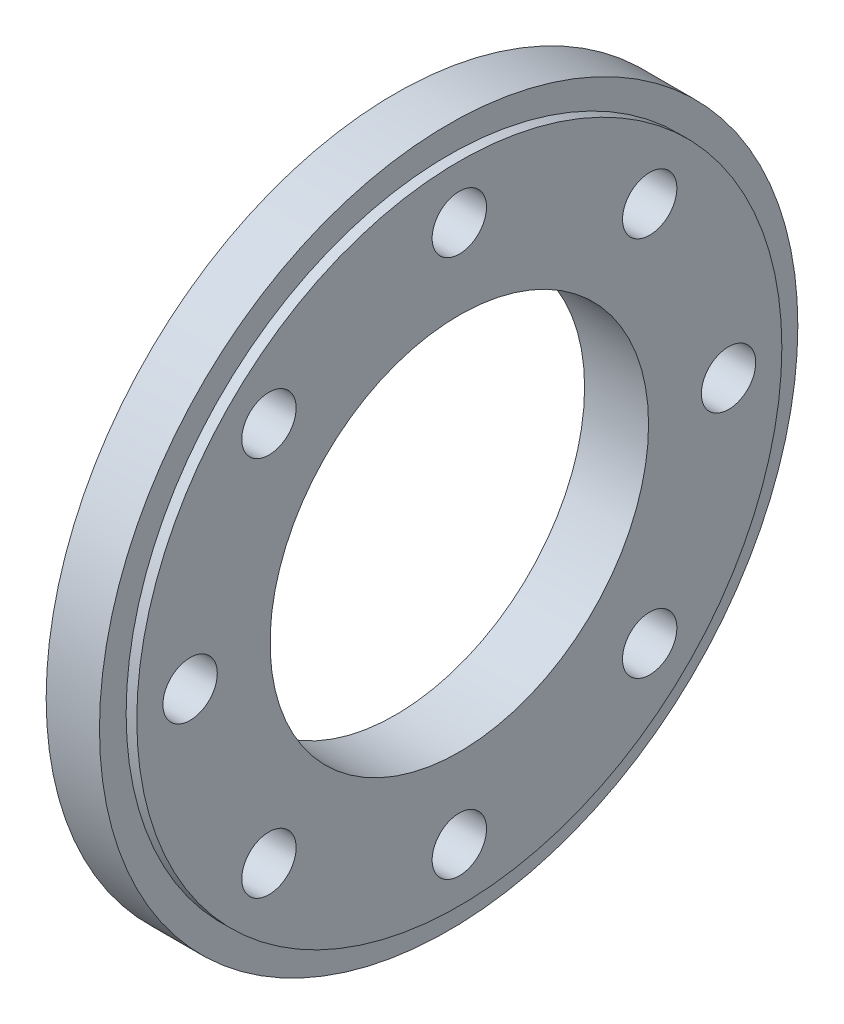
ISO-10303-21;
HEADER;
FILE_DESCRIPTION(('STEP AP214'),'2;1');
FILE_NAME('part.step','',(''),(''),'','','');
FILE_SCHEMA(('AUTOMOTIVE_DESIGN { 1 0 10303 214 1 1 1 1 }'));
ENDSEC;
DATA;
#1=APPLICATION_CONTEXT('core data for automotive mechanical design processes');
#2=APPLICATION_PROTOCOL_DEFINITION('international standard','automotive_design',2000,#1);
#3=PRODUCT_CONTEXT('',#1,'mechanical');
#4=PRODUCT('Part','Part','',(#3));
#5=PRODUCT_RELATED_PRODUCT_CATEGORY('part','',(#4));
#6=PRODUCT_DEFINITION_FORMATION('','',#4);
#7=PRODUCT_DEFINITION_CONTEXT('part definition',#1,'design');
#8=PRODUCT_DEFINITION('design','',#6,#7);
#9=PRODUCT_DEFINITION_SHAPE('','',#8);
#10=(LENGTH_UNIT() NAMED_UNIT(*) SI_UNIT(.MILLI.,.METRE.));
#11=(NAMED_UNIT(*) PLANE_ANGLE_UNIT() SI_UNIT($,.RADIAN.));
#12=(NAMED_UNIT(*) SI_UNIT($,.STERADIAN.) SOLID_ANGLE_UNIT());
#13=UNCERTAINTY_MEASURE_WITH_UNIT(LENGTH_MEASURE(1.E-05),#10,'distance_accuracy_value','');
#14=(GEOMETRIC_REPRESENTATION_CONTEXT(3) GLOBAL_UNCERTAINTY_ASSIGNED_CONTEXT((#13)) GLOBAL_UNIT_ASSIGNED_CONTEXT((#10,
#11,#12)) REPRESENTATION_CONTEXT('',''));
#15=CARTESIAN_POINT('',(0.,0.,0.));
#16=DIRECTION('',(0.,0.,1.));
#17=DIRECTION('',(1.,0.,0.));
#18=AXIS2_PLACEMENT_3D('',#15,#16,#17);
#19=CARTESIAN_POINT('',(6.,0.,0.));
#20=DIRECTION('',(1.,0.,0.));
#21=DIRECTION('',(0.,0.,-1.));
#22=AXIS2_PLACEMENT_3D('',#19,#20,#21);
#23=PLANE('',#22);
#24=CARTESIAN_POINT('',(6.,35.7088924499206,35.7088924499206));
#25=DIRECTION('',(1.,0.,0.));
#26=DIRECTION('',(0.,0.,-1.));
#27=AXIS2_PLACEMENT_3D('',#24,#25,#26);
#28=CIRCLE('',#27,5.1);
#29=CARTESIAN_POINT('',(6.,35.7088924499206,30.6088924499206));
#30=VERTEX_POINT('',#29);
#31=EDGE_CURVE('E114',#30,#30,#28,.T.);
#32=ORIENTED_EDGE('',*,*,#31,.F.);
#33=EDGE_LOOP('',(#32));
#34=FACE_BOUND('',#33,.T.);
#35=CARTESIAN_POINT('',(6.,-35.7088924499206,35.7088924499206));
#36=DIRECTION('',(1.,0.,0.));
#37=DIRECTION('',(0.,0.,-1.));
#38=AXIS2_PLACEMENT_3D('',#35,#36,#37);
#39=CIRCLE('',#38,5.1);
#40=CARTESIAN_POINT('',(6.,-35.7088924499206,30.6088924499206));
#41=VERTEX_POINT('',#40);
#42=EDGE_CURVE('E98',#41,#41,#39,.T.);
#43=ORIENTED_EDGE('',*,*,#42,.F.);
#44=EDGE_LOOP('',(#43));
#45=FACE_BOUND('',#44,.T.);
#46=CARTESIAN_POINT('',(6.,-35.7088924499206,-35.7088924499206));
#47=DIRECTION('',(1.,0.,0.));
#48=DIRECTION('',(0.,0.,-1.));
#49=AXIS2_PLACEMENT_3D('',#46,#47,#48);
#50=CIRCLE('',#49,5.09999999999999);
#51=CARTESIAN_POINT('',(6.,-35.7088924499206,-40.8088924499206));
#52=VERTEX_POINT('',#51);
#53=EDGE_CURVE('E82',#52,#52,#50,.T.);
#54=ORIENTED_EDGE('',*,*,#53,.F.);
#55=EDGE_LOOP('',(#54));
#56=FACE_BOUND('',#55,.T.);
#57=CARTESIAN_POINT('',(6.,35.7088924499206,-35.7088924499206));
#58=DIRECTION('',(1.,0.,0.));
#59=DIRECTION('',(0.,0.,-1.));
#60=AXIS2_PLACEMENT_3D('',#57,#58,#59);
#61=CIRCLE('',#60,5.1);
#62=CARTESIAN_POINT('',(6.,35.7088924499206,-40.8088924499206));
#63=VERTEX_POINT('',#62);
#64=EDGE_CURVE('E66',#63,#63,#61,.T.);
#65=ORIENTED_EDGE('',*,*,#64,.F.);
#66=EDGE_LOOP('',(#65));
#67=FACE_BOUND('',#66,.T.);
#68=CARTESIAN_POINT('',(6.,0.,0.));
#69=DIRECTION('',(1.,0.,0.));
#70=DIRECTION('',(0.,0.,-1.));
#71=AXIS2_PLACEMENT_3D('',#68,#69,#70);
#72=CIRCLE('',#71,35.5);
#73=CARTESIAN_POINT('',(6.,0.,-35.5));
#74=VERTEX_POINT('',#73);
#75=EDGE_CURVE('E47',#74,#74,#72,.T.);
#76=ORIENTED_EDGE('',*,*,#75,.F.);
#77=EDGE_LOOP('',(#76));
#78=FACE_BOUND('',#77,.T.);
#79=CARTESIAN_POINT('',(6.,50.5,0.));
#80=DIRECTION('',(1.,0.,0.));
#81=DIRECTION('',(0.,0.,-1.));
#82=AXIS2_PLACEMENT_3D('',#79,#80,#81);
#83=CIRCLE('',#82,5.1);
#84=CARTESIAN_POINT('',(6.,50.5,-5.1));
#85=VERTEX_POINT('',#84);
#86=EDGE_CURVE('E60',#85,#85,#83,.T.);
#87=ORIENTED_EDGE('',*,*,#86,.F.);
#88=EDGE_LOOP('',(#87));
#89=FACE_BOUND('',#88,.T.);
#90=CARTESIAN_POINT('',(6.,0.,-50.5));
#91=DIRECTION('',(1.,0.,0.));
#92=DIRECTION('',(0.,0.,-1.));
#93=AXIS2_PLACEMENT_3D('',#90,#91,#92);
#94=CIRCLE('',#93,5.10000000000001);
#95=CARTESIAN_POINT('',(6.,0.,-55.6));
#96=VERTEX_POINT('',#95);
#97=EDGE_CURVE('E74',#96,#96,#94,.T.);
#98=ORIENTED_EDGE('',*,*,#97,.F.);
#99=EDGE_LOOP('',(#98));
#100=FACE_BOUND('',#99,.T.);
#101=CARTESIAN_POINT('',(6.,-50.5,0.));
#102=DIRECTION('',(1.,0.,0.));
#103=DIRECTION('',(0.,0.,-1.));
#104=AXIS2_PLACEMENT_3D('',#101,#102,#103);
#105=CIRCLE('',#104,5.1);
#106=CARTESIAN_POINT('',(6.,-50.5,-5.10000000000001));
#107=VERTEX_POINT('',#106);
#108=EDGE_CURVE('E90',#107,#107,#105,.T.);
#109=ORIENTED_EDGE('',*,*,#108,.F.);
#110=EDGE_LOOP('',(#109));
#111=FACE_BOUND('',#110,.T.);
#112=CARTESIAN_POINT('',(6.,0.,50.5));
#113=DIRECTION('',(1.,0.,0.));
#114=DIRECTION('',(0.,0.,-1.));
#115=AXIS2_PLACEMENT_3D('',#112,#113,#114);
#116=CIRCLE('',#115,5.1);
#117=CARTESIAN_POINT('',(6.,0.,45.4));
#118=VERTEX_POINT('',#117);
#119=EDGE_CURVE('E106',#118,#118,#116,.T.);
#120=ORIENTED_EDGE('',*,*,#119,.F.);
#121=EDGE_LOOP('',(#120));
#122=FACE_BOUND('',#121,.T.);
#123=CARTESIAN_POINT('',(6.,0.,0.));
#124=DIRECTION('',(1.,0.,0.));
#125=DIRECTION('',(0.,0.,-1.));
#126=AXIS2_PLACEMENT_3D('',#123,#124,#125);
#127=CIRCLE('',#126,60.5);
#128=CARTESIAN_POINT('',(6.,0.,-60.5));
#129=VERTEX_POINT('',#128);
#130=EDGE_CURVE('E130',#129,#129,#127,.T.);
#131=ORIENTED_EDGE('',*,*,#130,.T.);
#132=EDGE_LOOP('',(#131));
#133=FACE_BOUND('',#132,.T.);
#134=ADVANCED_FACE('F39',(#34,#45,#56,#67,#78,#89,#100,#111,#122,#133),#23,.T.);
#135=CARTESIAN_POINT('',(6.,0.,0.));
#136=DIRECTION('',(-1.,0.,0.));
#137=DIRECTION('',(0.,0.,1.));
#138=AXIS2_PLACEMENT_3D('',#135,#136,#137);
#139=CYLINDRICAL_SURFACE('',#138,65.5);
#140=CARTESIAN_POINT('',(-6.,0.,0.));
#141=DIRECTION('',(1.,0.,0.));
#142=DIRECTION('',(0.,0.,-1.));
#143=AXIS2_PLACEMENT_3D('',#140,#141,#142);
#144=CIRCLE('',#143,65.5);
#145=CARTESIAN_POINT('',(-6.,0.,-65.5));
#146=VERTEX_POINT('',#145);
#147=EDGE_CURVE('E10',#146,#146,#144,.T.);
#148=ORIENTED_EDGE('',*,*,#147,.T.);
#149=EDGE_LOOP('',(#148));
#150=FACE_BOUND('',#149,.T.);
#151=CARTESIAN_POINT('',(4.,0.,0.));
#152=DIRECTION('',(1.,0.,0.));
#153=DIRECTION('',(0.,0.,-1.));
#154=AXIS2_PLACEMENT_3D('',#151,#152,#153);
#155=CIRCLE('',#154,65.5);
#156=CARTESIAN_POINT('',(4.,0.,-65.5));
#157=VERTEX_POINT('',#156);
#158=EDGE_CURVE('E122',#157,#157,#155,.T.);
#159=ORIENTED_EDGE('',*,*,#158,.F.);
#160=EDGE_LOOP('',(#159));
#161=FACE_BOUND('',#160,.T.);
#162=ADVANCED_FACE('F41',(#150,#161),#139,.T.);
#163=CARTESIAN_POINT('',(-6.,0.,0.));
#164=DIRECTION('',(1.,0.,0.));
#165=DIRECTION('',(0.,0.,-1.));
#166=AXIS2_PLACEMENT_3D('',#163,#164,#165);
#167=PLANE('',#166);
#168=ORIENTED_EDGE('',*,*,#147,.F.);
#169=EDGE_LOOP('',(#168));
#170=FACE_BOUND('',#169,.T.);
#171=CARTESIAN_POINT('',(-6.,0.,0.));
#172=DIRECTION('',(1.,0.,0.));
#173=DIRECTION('',(0.,0.,-1.));
#174=AXIS2_PLACEMENT_3D('',#171,#172,#173);
#175=CIRCLE('',#174,35.5);
#176=CARTESIAN_POINT('',(-6.,0.,-35.5));
#177=VERTEX_POINT('',#176);
#178=EDGE_CURVE('E53',#177,#177,#175,.T.);
#179=ORIENTED_EDGE('',*,*,#178,.T.);
#180=EDGE_LOOP('',(#179));
#181=FACE_BOUND('',#180,.T.);
#182=CARTESIAN_POINT('',(-6.,50.5,0.));
#183=DIRECTION('',(1.,0.,0.));
#184=DIRECTION('',(0.,0.,-1.));
#185=AXIS2_PLACEMENT_3D('',#182,#183,#184);
#186=CIRCLE('',#185,5.1);
#187=CARTESIAN_POINT('',(-6.,50.5,-5.1));
#188=VERTEX_POINT('',#187);
#189=EDGE_CURVE('E62',#188,#188,#186,.T.);
#190=ORIENTED_EDGE('',*,*,#189,.T.);
#191=EDGE_LOOP('',(#190));
#192=FACE_BOUND('',#191,.T.);
#193=CARTESIAN_POINT('',(-6.,35.7088924499206,-35.7088924499206));
#194=DIRECTION('',(1.,0.,0.));
#195=DIRECTION('',(0.,0.,-1.));
#196=AXIS2_PLACEMENT_3D('',#193,#194,#195);
#197=CIRCLE('',#196,5.1);
#198=CARTESIAN_POINT('',(-6.,35.7088924499206,-40.8088924499206));
#199=VERTEX_POINT('',#198);
#200=EDGE_CURVE('E70',#199,#199,#197,.T.);
#201=ORIENTED_EDGE('',*,*,#200,.T.);
#202=EDGE_LOOP('',(#201));
#203=FACE_BOUND('',#202,.T.);
#204=CARTESIAN_POINT('',(-6.,0.,-50.5));
#205=DIRECTION('',(1.,0.,0.));
#206=DIRECTION('',(0.,0.,-1.));
#207=AXIS2_PLACEMENT_3D('',#204,#205,#206);
#208=CIRCLE('',#207,5.10000000000001);
#209=CARTESIAN_POINT('',(-6.,0.,-55.6));
#210=VERTEX_POINT('',#209);
#211=EDGE_CURVE('E78',#210,#210,#208,.T.);
#212=ORIENTED_EDGE('',*,*,#211,.T.);
#213=EDGE_LOOP('',(#212));
#214=FACE_BOUND('',#213,.T.);
#215=CARTESIAN_POINT('',(-6.,-35.7088924499206,-35.7088924499206));
#216=DIRECTION('',(1.,0.,0.));
#217=DIRECTION('',(0.,0.,-1.));
#218=AXIS2_PLACEMENT_3D('',#215,#216,#217);
#219=CIRCLE('',#218,5.09999999999999);
#220=CARTESIAN_POINT('',(-6.,-35.7088924499206,-40.8088924499206));
#221=VERTEX_POINT('',#220);
#222=EDGE_CURVE('E86',#221,#221,#219,.T.);
#223=ORIENTED_EDGE('',*,*,#222,.T.);
#224=EDGE_LOOP('',(#223));
#225=FACE_BOUND('',#224,.T.);
#226=CARTESIAN_POINT('',(-6.,-50.5,0.));
#227=DIRECTION('',(1.,0.,0.));
#228=DIRECTION('',(0.,0.,-1.));
#229=AXIS2_PLACEMENT_3D('',#226,#227,#228);
#230=CIRCLE('',#229,5.1);
#231=CARTESIAN_POINT('',(-6.,-50.5,-5.10000000000001));
#232=VERTEX_POINT('',#231);
#233=EDGE_CURVE('E94',#232,#232,#230,.T.);
#234=ORIENTED_EDGE('',*,*,#233,.T.);
#235=EDGE_LOOP('',(#234));
#236=FACE_BOUND('',#235,.T.);
#237=CARTESIAN_POINT('',(-6.,-35.7088924499206,35.7088924499206));
#238=DIRECTION('',(1.,0.,0.));
#239=DIRECTION('',(0.,0.,-1.));
#240=AXIS2_PLACEMENT_3D('',#237,#238,#239);
#241=CIRCLE('',#240,5.1);
#242=CARTESIAN_POINT('',(-6.,-35.7088924499206,30.6088924499206));
#243=VERTEX_POINT('',#242);
#244=EDGE_CURVE('E102',#243,#243,#241,.T.);
#245=ORIENTED_EDGE('',*,*,#244,.T.);
#246=EDGE_LOOP('',(#245));
#247=FACE_BOUND('',#246,.T.);
#248=CARTESIAN_POINT('',(-6.,0.,50.5));
#249=DIRECTION('',(1.,0.,0.));
#250=DIRECTION('',(0.,0.,-1.));
#251=AXIS2_PLACEMENT_3D('',#248,#249,#250);
#252=CIRCLE('',#251,5.1);
#253=CARTESIAN_POINT('',(-6.,0.,45.4));
#254=VERTEX_POINT('',#253);
#255=EDGE_CURVE('E110',#254,#254,#252,.T.);
#256=ORIENTED_EDGE('',*,*,#255,.T.);
#257=EDGE_LOOP('',(#256));
#258=FACE_BOUND('',#257,.T.);
#259=CARTESIAN_POINT('',(-6.,35.7088924499206,35.7088924499206));
#260=DIRECTION('',(1.,0.,0.));
#261=DIRECTION('',(0.,0.,-1.));
#262=AXIS2_PLACEMENT_3D('',#259,#260,#261);
#263=CIRCLE('',#262,5.1);
#264=CARTESIAN_POINT('',(-6.,35.7088924499206,30.6088924499206));
#265=VERTEX_POINT('',#264);
#266=EDGE_CURVE('E118',#265,#265,#263,.T.);
#267=ORIENTED_EDGE('',*,*,#266,.T.);
#268=EDGE_LOOP('',(#267));
#269=FACE_BOUND('',#268,.T.);
#270=ADVANCED_FACE('F150',(#170,#181,#192,#203,#214,#225,#236,#247,#258,#269),#167,.F.);
#271=CARTESIAN_POINT('',(6.,0.,0.));
#272=DIRECTION('',(-1.,0.,0.));
#273=DIRECTION('',(0.,0.,1.));
#274=AXIS2_PLACEMENT_3D('',#271,#272,#273);
#275=CYLINDRICAL_SURFACE('',#274,35.5);
#276=ORIENTED_EDGE('',*,*,#75,.T.);
#277=EDGE_LOOP('',(#276));
#278=FACE_BOUND('',#277,.T.);
#279=ORIENTED_EDGE('',*,*,#178,.F.);
#280=EDGE_LOOP('',(#279));
#281=FACE_BOUND('',#280,.T.);
#282=ADVANCED_FACE('F155',(#278,#281),#275,.F.);
#283=CARTESIAN_POINT('',(6.,50.5,0.));
#284=DIRECTION('',(-1.,0.,0.));
#285=DIRECTION('',(0.,0.,1.));
#286=AXIS2_PLACEMENT_3D('',#283,#284,#285);
#287=CYLINDRICAL_SURFACE('',#286,5.1);
#288=ORIENTED_EDGE('',*,*,#86,.T.);
#289=EDGE_LOOP('',(#288));
#290=FACE_BOUND('',#289,.T.);
#291=ORIENTED_EDGE('',*,*,#189,.F.);
#292=EDGE_LOOP('',(#291));
#293=FACE_BOUND('',#292,.T.);
#294=ADVANCED_FACE('F166',(#290,#293),#287,.F.);
#295=CARTESIAN_POINT('',(6.,35.7088924499206,-35.7088924499206));
#296=DIRECTION('',(-1.,0.,0.));
#297=DIRECTION('',(0.,0.,1.));
#298=AXIS2_PLACEMENT_3D('',#295,#296,#297);
#299=CYLINDRICAL_SURFACE('',#298,5.1);
#300=ORIENTED_EDGE('',*,*,#64,.T.);
#301=EDGE_LOOP('',(#300));
#302=FACE_BOUND('',#301,.T.);
#303=ORIENTED_EDGE('',*,*,#200,.F.);
#304=EDGE_LOOP('',(#303));
#305=FACE_BOUND('',#304,.T.);
#306=ADVANCED_FACE('F169',(#302,#305),#299,.F.);
#307=CARTESIAN_POINT('',(6.,0.,-50.5));
#308=DIRECTION('',(-1.,0.,0.));
#309=DIRECTION('',(0.,0.,1.));
#310=AXIS2_PLACEMENT_3D('',#307,#308,#309);
#311=CYLINDRICAL_SURFACE('',#310,5.10000000000001);
#312=ORIENTED_EDGE('',*,*,#97,.T.);
#313=EDGE_LOOP('',(#312));
#314=FACE_BOUND('',#313,.T.);
#315=ORIENTED_EDGE('',*,*,#211,.F.);
#316=EDGE_LOOP('',(#315));
#317=FACE_BOUND('',#316,.T.);
#318=ADVANCED_FACE('F173',(#314,#317),#311,.F.);
#319=CARTESIAN_POINT('',(6.,-35.7088924499206,-35.7088924499206));
#320=DIRECTION('',(-1.,0.,0.));
#321=DIRECTION('',(0.,0.,1.));
#322=AXIS2_PLACEMENT_3D('',#319,#320,#321);
#323=CYLINDRICAL_SURFACE('',#322,5.09999999999999);
#324=ORIENTED_EDGE('',*,*,#53,.T.);
#325=EDGE_LOOP('',(#324));
#326=FACE_BOUND('',#325,.T.);
#327=ORIENTED_EDGE('',*,*,#222,.F.);
#328=EDGE_LOOP('',(#327));
#329=FACE_BOUND('',#328,.T.);
#330=ADVANCED_FACE('F177',(#326,#329),#323,.F.);
#331=CARTESIAN_POINT('',(6.,-50.5,0.));
#332=DIRECTION('',(-1.,0.,0.));
#333=DIRECTION('',(0.,0.,1.));
#334=AXIS2_PLACEMENT_3D('',#331,#332,#333);
#335=CYLINDRICAL_SURFACE('',#334,5.1);
#336=ORIENTED_EDGE('',*,*,#108,.T.);
#337=EDGE_LOOP('',(#336));
#338=FACE_BOUND('',#337,.T.);
#339=ORIENTED_EDGE('',*,*,#233,.F.);
#340=EDGE_LOOP('',(#339));
#341=FACE_BOUND('',#340,.T.);
#342=ADVANCED_FACE('F181',(#338,#341),#335,.F.);
#343=CARTESIAN_POINT('',(6.,-35.7088924499206,35.7088924499206));
#344=DIRECTION('',(-1.,0.,0.));
#345=DIRECTION('',(0.,0.,1.));
#346=AXIS2_PLACEMENT_3D('',#343,#344,#345);
#347=CYLINDRICAL_SURFACE('',#346,5.1);
#348=ORIENTED_EDGE('',*,*,#42,.T.);
#349=EDGE_LOOP('',(#348));
#350=FACE_BOUND('',#349,.T.);
#351=ORIENTED_EDGE('',*,*,#244,.F.);
#352=EDGE_LOOP('',(#351));
#353=FACE_BOUND('',#352,.T.);
#354=ADVANCED_FACE('F185',(#350,#353),#347,.F.);
#355=CARTESIAN_POINT('',(6.,0.,50.5));
#356=DIRECTION('',(-1.,0.,0.));
#357=DIRECTION('',(0.,0.,1.));
#358=AXIS2_PLACEMENT_3D('',#355,#356,#357);
#359=CYLINDRICAL_SURFACE('',#358,5.1);
#360=ORIENTED_EDGE('',*,*,#119,.T.);
#361=EDGE_LOOP('',(#360));
#362=FACE_BOUND('',#361,.T.);
#363=ORIENTED_EDGE('',*,*,#255,.F.);
#364=EDGE_LOOP('',(#363));
#365=FACE_BOUND('',#364,.T.);
#366=ADVANCED_FACE('F189',(#362,#365),#359,.F.);
#367=CARTESIAN_POINT('',(6.,35.7088924499206,35.7088924499206));
#368=DIRECTION('',(-1.,0.,0.));
#369=DIRECTION('',(0.,0.,1.));
#370=AXIS2_PLACEMENT_3D('',#367,#368,#369);
#371=CYLINDRICAL_SURFACE('',#370,5.1);
#372=ORIENTED_EDGE('',*,*,#31,.T.);
#373=EDGE_LOOP('',(#372));
#374=FACE_BOUND('',#373,.T.);
#375=ORIENTED_EDGE('',*,*,#266,.F.);
#376=EDGE_LOOP('',(#375));
#377=FACE_BOUND('',#376,.T.);
#378=ADVANCED_FACE('F145',(#374,#377),#371,.F.);
#379=CARTESIAN_POINT('',(4.,0.,0.));
#380=DIRECTION('',(1.,0.,0.));
#381=DIRECTION('',(0.,0.,-1.));
#382=AXIS2_PLACEMENT_3D('',#379,#380,#381);
#383=PLANE('',#382);
#384=CARTESIAN_POINT('',(4.,0.,0.));
#385=DIRECTION('',(1.,0.,0.));
#386=DIRECTION('',(0.,0.,-1.));
#387=AXIS2_PLACEMENT_3D('',#384,#385,#386);
#388=CIRCLE('',#387,60.5);
#389=CARTESIAN_POINT('',(4.,0.,-60.5));
#390=VERTEX_POINT('',#389);
#391=EDGE_CURVE('E129',#390,#390,#388,.T.);
#392=ORIENTED_EDGE('',*,*,#391,.F.);
#393=EDGE_LOOP('',(#392));
#394=FACE_BOUND('',#393,.T.);
#395=ORIENTED_EDGE('',*,*,#158,.T.);
#396=EDGE_LOOP('',(#395));
#397=FACE_BOUND('',#396,.T.);
#398=ADVANCED_FACE('F142',(#394,#397),#383,.T.);
#399=CARTESIAN_POINT('',(4.,0.,0.));
#400=DIRECTION('',(1.,0.,0.));
#401=DIRECTION('',(0.,0.,-1.));
#402=AXIS2_PLACEMENT_3D('',#399,#400,#401);
#403=CYLINDRICAL_SURFACE('',#402,60.5);
#404=ORIENTED_EDGE('',*,*,#391,.T.);
#405=EDGE_LOOP('',(#404));
#406=FACE_BOUND('',#405,.T.);
#407=ORIENTED_EDGE('',*,*,#130,.F.);
#408=EDGE_LOOP('',(#407));
#409=FACE_BOUND('',#408,.T.);
#410=ADVANCED_FACE('F139',(#406,#409),#403,.T.);
#411=CLOSED_SHELL('',(#134,#162,#270,#282,#294,#306,#318,#330,#342,#354,#366,#378,#398,#410));
#412=MANIFOLD_SOLID_BREP('B2',#411);
#413=ADVANCED_BREP_SHAPE_REPRESENTATION('',(#18,#412),#14);
#414=SHAPE_DEFINITION_REPRESENTATION(#9,#413);
ENDSEC;
END-ISO-10303-21;
